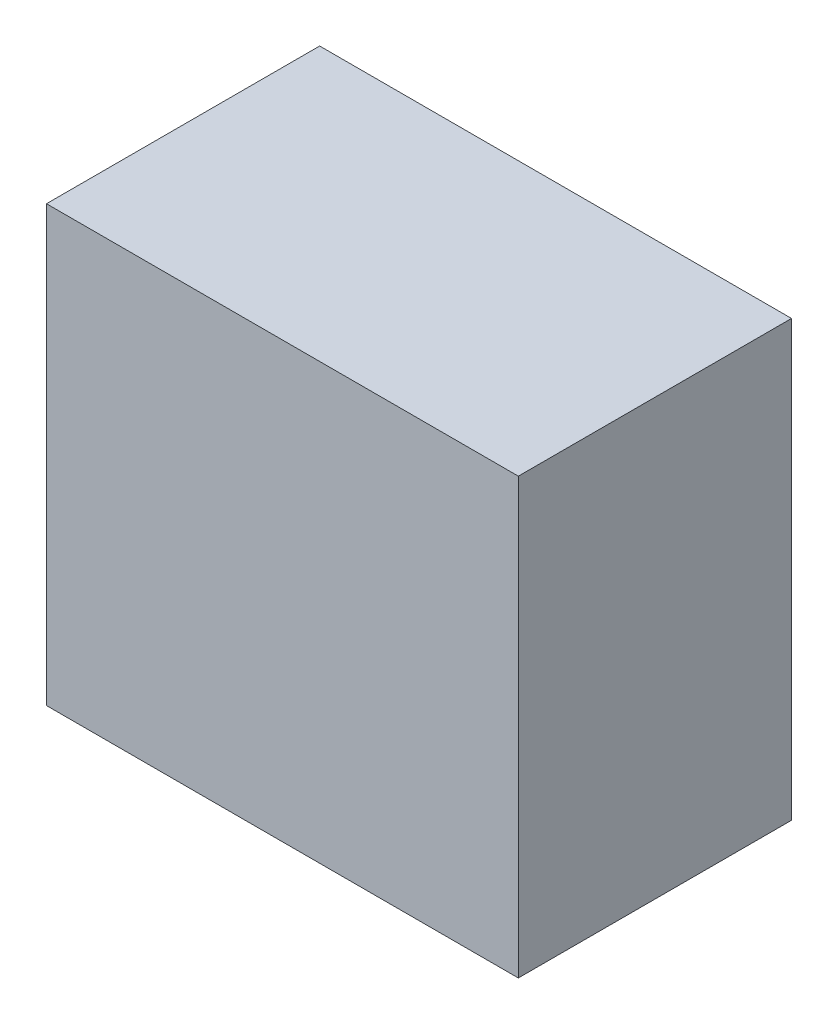
ISO-10303-21;
HEADER;
FILE_DESCRIPTION(('STEP AP214'),'2;1');
FILE_NAME('part.step','',(''),(''),'','','');
FILE_SCHEMA(('AUTOMOTIVE_DESIGN { 1 0 10303 214 1 1 1 1 }'));
ENDSEC;
DATA;
#1=APPLICATION_CONTEXT('core data for automotive mechanical design processes');
#2=APPLICATION_PROTOCOL_DEFINITION('international standard','automotive_design',2000,#1);
#3=PRODUCT_CONTEXT('',#1,'mechanical');
#4=PRODUCT('Part','Part','',(#3));
#5=PRODUCT_RELATED_PRODUCT_CATEGORY('part','',(#4));
#6=PRODUCT_DEFINITION_FORMATION('','',#4);
#7=PRODUCT_DEFINITION_CONTEXT('part definition',#1,'design');
#8=PRODUCT_DEFINITION('design','',#6,#7);
#9=PRODUCT_DEFINITION_SHAPE('','',#8);
#10=(LENGTH_UNIT() NAMED_UNIT(*) SI_UNIT(.MILLI.,.METRE.));
#11=(NAMED_UNIT(*) PLANE_ANGLE_UNIT() SI_UNIT($,.RADIAN.));
#12=(NAMED_UNIT(*) SI_UNIT($,.STERADIAN.) SOLID_ANGLE_UNIT());
#13=UNCERTAINTY_MEASURE_WITH_UNIT(LENGTH_MEASURE(1.E-05),#10,'distance_accuracy_value','');
#14=(GEOMETRIC_REPRESENTATION_CONTEXT(3) GLOBAL_UNCERTAINTY_ASSIGNED_CONTEXT((#13)) GLOBAL_UNIT_ASSIGNED_CONTEXT((#10,
#11,#12)) REPRESENTATION_CONTEXT('',''));
#15=CARTESIAN_POINT('',(0.,0.,0.));
#16=DIRECTION('',(0.,0.,1.));
#17=DIRECTION('',(1.,0.,0.));
#18=AXIS2_PLACEMENT_3D('',#15,#16,#17);
#19=CARTESIAN_POINT('',(19.,-17.5,22.));
#20=DIRECTION('',(-1.,0.,0.));
#21=DIRECTION('',(0.,0.,1.));
#22=AXIS2_PLACEMENT_3D('',#19,#20,#21);
#23=PLANE('',#22);
#24=DIRECTION('',(0.,1.,0.));
#25=VECTOR('',#24,1.);
#26=CARTESIAN_POINT('',(19.,-17.5,0.));
#27=LINE('',#26,#25);
#28=CARTESIAN_POINT('',(19.,-17.5,0.));
#29=VERTEX_POINT('',#28);
#30=CARTESIAN_POINT('',(19.,17.5,0.));
#31=VERTEX_POINT('',#30);
#32=EDGE_CURVE('E102',#29,#31,#27,.T.);
#33=ORIENTED_EDGE('',*,*,#32,.T.);
#34=DIRECTION('',(0.,0.,-1.));
#35=VECTOR('',#34,1.);
#36=CARTESIAN_POINT('',(19.,17.5,22.));
#37=LINE('',#36,#35);
#38=CARTESIAN_POINT('',(19.,17.5,22.));
#39=VERTEX_POINT('',#38);
#40=EDGE_CURVE('E11',#39,#31,#37,.T.);
#41=ORIENTED_EDGE('',*,*,#40,.F.);
#42=DIRECTION('',(0.,1.,0.));
#43=VECTOR('',#42,1.);
#44=CARTESIAN_POINT('',(19.,-17.5,22.));
#45=LINE('',#44,#43);
#46=CARTESIAN_POINT('',(19.,-17.5,22.));
#47=VERTEX_POINT('',#46);
#48=EDGE_CURVE('E95',#47,#39,#45,.T.);
#49=ORIENTED_EDGE('',*,*,#48,.F.);
#50=DIRECTION('',(0.,0.,-1.));
#51=VECTOR('',#50,1.);
#52=CARTESIAN_POINT('',(19.,-17.5,22.));
#53=LINE('',#52,#51);
#54=EDGE_CURVE('E99',#47,#29,#53,.T.);
#55=ORIENTED_EDGE('',*,*,#54,.T.);
#56=EDGE_LOOP('',(#33,#41,#49,#55));
#57=FACE_BOUND('',#56,.T.);
#58=ADVANCED_FACE('F41',(#57),#23,.F.);
#59=CARTESIAN_POINT('',(-19.,17.5,22.));
#60=DIRECTION('',(0.,-1.,0.));
#61=DIRECTION('',(0.,0.,-1.));
#62=AXIS2_PLACEMENT_3D('',#59,#60,#61);
#63=PLANE('',#62);
#64=DIRECTION('',(-1.,0.,0.));
#65=VECTOR('',#64,1.);
#66=CARTESIAN_POINT('',(-19.,17.5,0.));
#67=LINE('',#66,#65);
#68=CARTESIAN_POINT('',(-19.,17.5,0.));
#69=VERTEX_POINT('',#68);
#70=EDGE_CURVE('E96',#31,#69,#67,.T.);
#71=ORIENTED_EDGE('',*,*,#70,.T.);
#72=DIRECTION('',(0.,0.,-1.));
#73=VECTOR('',#72,1.);
#74=CARTESIAN_POINT('',(-19.,17.5,22.));
#75=LINE('',#74,#73);
#76=CARTESIAN_POINT('',(-19.,17.5,22.));
#77=VERTEX_POINT('',#76);
#78=EDGE_CURVE('E47',#77,#69,#75,.T.);
#79=ORIENTED_EDGE('',*,*,#78,.F.);
#80=DIRECTION('',(-1.,0.,0.));
#81=VECTOR('',#80,1.);
#82=CARTESIAN_POINT('',(-19.,17.5,22.));
#83=LINE('',#82,#81);
#84=EDGE_CURVE('E87',#39,#77,#83,.T.);
#85=ORIENTED_EDGE('',*,*,#84,.F.);
#86=ORIENTED_EDGE('',*,*,#40,.T.);
#87=EDGE_LOOP('',(#71,#79,#85,#86));
#88=FACE_BOUND('',#87,.T.);
#89=ADVANCED_FACE('F92',(#88),#63,.F.);
#90=CARTESIAN_POINT('',(-19.,-17.5,22.));
#91=DIRECTION('',(1.,0.,0.));
#92=DIRECTION('',(0.,0.,-1.));
#93=AXIS2_PLACEMENT_3D('',#90,#91,#92);
#94=PLANE('',#93);
#95=DIRECTION('',(0.,-1.,0.));
#96=VECTOR('',#95,1.);
#97=CARTESIAN_POINT('',(-19.,-17.5,0.));
#98=LINE('',#97,#96);
#99=CARTESIAN_POINT('',(-19.,-17.5,0.));
#100=VERTEX_POINT('',#99);
#101=EDGE_CURVE('E74',#69,#100,#98,.T.);
#102=ORIENTED_EDGE('',*,*,#101,.T.);
#103=DIRECTION('',(0.,0.,-1.));
#104=VECTOR('',#103,1.);
#105=CARTESIAN_POINT('',(-19.,-17.5,22.));
#106=LINE('',#105,#104);
#107=CARTESIAN_POINT('',(-19.,-17.5,22.));
#108=VERTEX_POINT('',#107);
#109=EDGE_CURVE('E100',#108,#100,#106,.T.);
#110=ORIENTED_EDGE('',*,*,#109,.F.);
#111=DIRECTION('',(0.,-1.,0.));
#112=VECTOR('',#111,1.);
#113=CARTESIAN_POINT('',(-19.,-17.5,22.));
#114=LINE('',#113,#112);
#115=EDGE_CURVE('E89',#77,#108,#114,.T.);
#116=ORIENTED_EDGE('',*,*,#115,.F.);
#117=ORIENTED_EDGE('',*,*,#78,.T.);
#118=EDGE_LOOP('',(#102,#110,#116,#117));
#119=FACE_BOUND('',#118,.T.);
#120=ADVANCED_FACE('F98',(#119),#94,.F.);
#121=CARTESIAN_POINT('',(-19.,-17.5,22.));
#122=DIRECTION('',(0.,1.,0.));
#123=DIRECTION('',(0.,0.,1.));
#124=AXIS2_PLACEMENT_3D('',#121,#122,#123);
#125=PLANE('',#124);
#126=DIRECTION('',(1.,0.,0.));
#127=VECTOR('',#126,1.);
#128=CARTESIAN_POINT('',(-19.,-17.5,0.));
#129=LINE('',#128,#127);
#130=EDGE_CURVE('E79',#100,#29,#129,.T.);
#131=ORIENTED_EDGE('',*,*,#130,.T.);
#132=ORIENTED_EDGE('',*,*,#54,.F.);
#133=DIRECTION('',(1.,0.,0.));
#134=VECTOR('',#133,1.);
#135=CARTESIAN_POINT('',(-19.,-17.5,22.));
#136=LINE('',#135,#134);
#137=EDGE_CURVE('E60',#108,#47,#136,.T.);
#138=ORIENTED_EDGE('',*,*,#137,.F.);
#139=ORIENTED_EDGE('',*,*,#109,.T.);
#140=EDGE_LOOP('',(#131,#132,#138,#139));
#141=FACE_BOUND('',#140,.T.);
#142=ADVANCED_FACE('F112',(#141),#125,.F.);
#143=CARTESIAN_POINT('',(0.,0.,22.));
#144=DIRECTION('',(0.,0.,-1.));
#145=DIRECTION('',(-1.,0.,0.));
#146=AXIS2_PLACEMENT_3D('',#143,#144,#145);
#147=PLANE('',#146);
#148=ORIENTED_EDGE('',*,*,#48,.T.);
#149=ORIENTED_EDGE('',*,*,#84,.T.);
#150=ORIENTED_EDGE('',*,*,#115,.T.);
#151=ORIENTED_EDGE('',*,*,#137,.T.);
#152=EDGE_LOOP('',(#148,#149,#150,#151));
#153=FACE_BOUND('',#152,.T.);
#154=ADVANCED_FACE('F86',(#153),#147,.F.);
#155=CARTESIAN_POINT('',(0.,0.,0.));
#156=DIRECTION('',(0.,0.,-1.));
#157=DIRECTION('',(-1.,0.,0.));
#158=AXIS2_PLACEMENT_3D('',#155,#156,#157);
#159=PLANE('',#158);
#160=ORIENTED_EDGE('',*,*,#32,.F.);
#161=ORIENTED_EDGE('',*,*,#130,.F.);
#162=ORIENTED_EDGE('',*,*,#101,.F.);
#163=ORIENTED_EDGE('',*,*,#70,.F.);
#164=EDGE_LOOP('',(#160,#161,#162,#163));
#165=FACE_BOUND('',#164,.T.);
#166=ADVANCED_FACE('F111',(#165),#159,.T.);
#167=CLOSED_SHELL('',(#58,#89,#120,#142,#154,#166));
#168=MANIFOLD_SOLID_BREP('B2',#167);
#169=ADVANCED_BREP_SHAPE_REPRESENTATION('',(#18,#168),#14);
#170=SHAPE_DEFINITION_REPRESENTATION(#9,#169);
ENDSEC;
END-ISO-10303-21;
